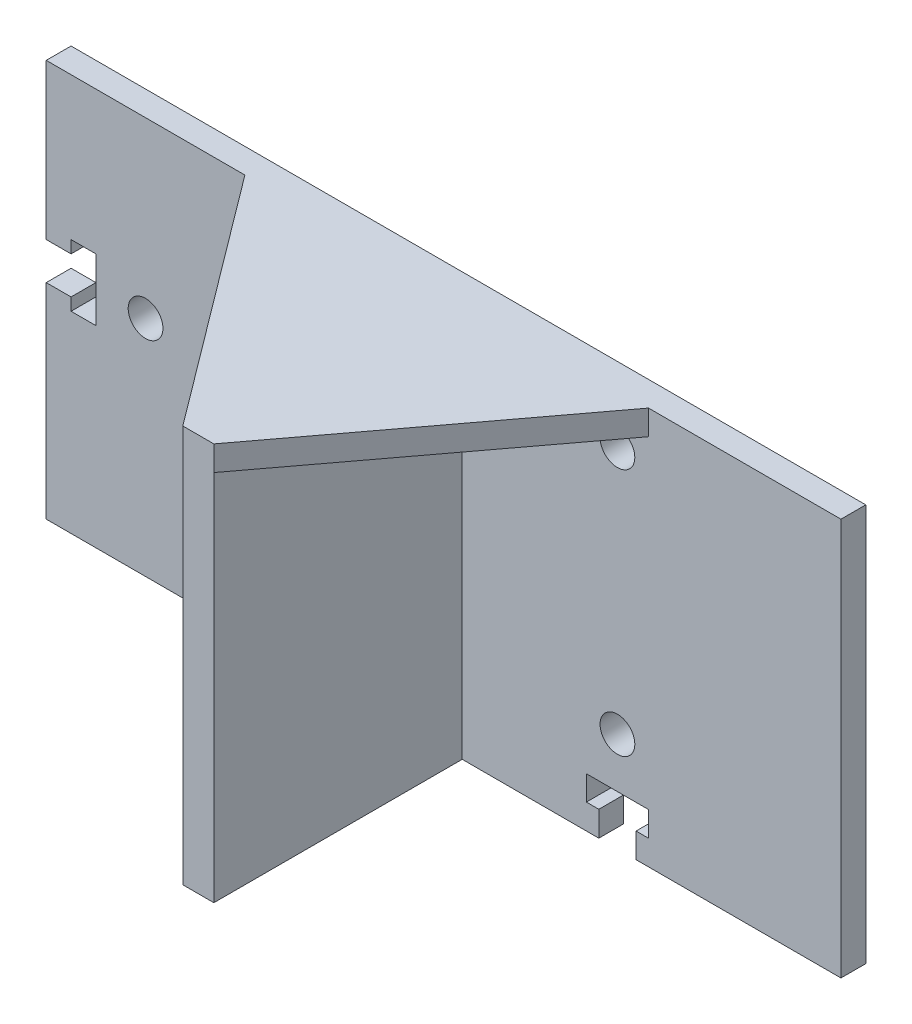
ISO-10303-21;
HEADER;
FILE_DESCRIPTION(('STEP AP214'),'2;1');
FILE_NAME('part.step','',(''),(''),'','','');
FILE_SCHEMA(('AUTOMOTIVE_DESIGN { 1 0 10303 214 1 1 1 1 }'));
ENDSEC;
DATA;
#1=APPLICATION_CONTEXT('core data for automotive mechanical design processes');
#2=APPLICATION_PROTOCOL_DEFINITION('international standard','automotive_design',2000,#1);
#3=PRODUCT_CONTEXT('',#1,'mechanical');
#4=PRODUCT('Part','Part','',(#3));
#5=PRODUCT_RELATED_PRODUCT_CATEGORY('part','',(#4));
#6=PRODUCT_DEFINITION_FORMATION('','',#4);
#7=PRODUCT_DEFINITION_CONTEXT('part definition',#1,'design');
#8=PRODUCT_DEFINITION('design','',#6,#7);
#9=PRODUCT_DEFINITION_SHAPE('','',#8);
#10=(LENGTH_UNIT() NAMED_UNIT(*) SI_UNIT(.MILLI.,.METRE.));
#11=(NAMED_UNIT(*) PLANE_ANGLE_UNIT() SI_UNIT($,.RADIAN.));
#12=(NAMED_UNIT(*) SI_UNIT($,.STERADIAN.) SOLID_ANGLE_UNIT());
#13=UNCERTAINTY_MEASURE_WITH_UNIT(LENGTH_MEASURE(1.E-05),#10,'distance_accuracy_value','');
#14=(GEOMETRIC_REPRESENTATION_CONTEXT(3) GLOBAL_UNCERTAINTY_ASSIGNED_CONTEXT((#13)) GLOBAL_UNIT_ASSIGNED_CONTEXT((#10,
#11,#12)) REPRESENTATION_CONTEXT('',''));
#15=CARTESIAN_POINT('',(0.,0.,0.));
#16=DIRECTION('',(0.,0.,1.));
#17=DIRECTION('',(1.,0.,0.));
#18=AXIS2_PLACEMENT_3D('',#15,#16,#17);
#19=CARTESIAN_POINT('',(0.,0.,2.));
#20=DIRECTION('',(0.,0.,1.));
#21=DIRECTION('',(1.,0.,0.));
#22=AXIS2_PLACEMENT_3D('',#19,#20,#21);
#23=PLANE('',#22);
#24=CARTESIAN_POINT('',(8.,18.,2.));
#25=DIRECTION('',(0.,0.,1.));
#26=DIRECTION('',(1.,0.,0.));
#27=AXIS2_PLACEMENT_3D('',#24,#25,#26);
#28=CIRCLE('',#27,1.4);
#29=CARTESIAN_POINT('',(9.4,18.,2.));
#30=VERTEX_POINT('',#29);
#31=EDGE_CURVE('E449',#30,#30,#28,.T.);
#32=ORIENTED_EDGE('',*,*,#31,.F.);
#33=EDGE_LOOP('',(#32));
#34=FACE_BOUND('',#33,.T.);
#35=CARTESIAN_POINT('',(28.,18.,2.));
#36=DIRECTION('',(0.,0.,1.));
#37=DIRECTION('',(1.,0.,0.));
#38=AXIS2_PLACEMENT_3D('',#35,#36,#37);
#39=CIRCLE('',#38,1.4);
#40=CARTESIAN_POINT('',(29.4,18.,2.));
#41=VERTEX_POINT('',#40);
#42=EDGE_CURVE('E459',#41,#41,#39,.T.);
#43=ORIENTED_EDGE('',*,*,#42,.F.);
#44=EDGE_LOOP('',(#43));
#45=FACE_BOUND('',#44,.T.);
#46=DIRECTION('',(0.,-1.,0.));
#47=VECTOR('',#46,1.);
#48=CARTESIAN_POINT('',(31.,30.,2.));
#49=LINE('',#48,#47);
#50=CARTESIAN_POINT('',(31.,30.,2.));
#51=VERTEX_POINT('',#50);
#52=CARTESIAN_POINT('',(31.,0.,2.));
#53=VERTEX_POINT('',#52);
#54=EDGE_CURVE('E231',#51,#53,#49,.T.);
#55=ORIENTED_EDGE('',*,*,#54,.F.);
#56=DIRECTION('',(1.,0.,0.));
#57=VECTOR('',#56,1.);
#58=CARTESIAN_POINT('',(31.,30.,2.));
#59=LINE('',#58,#57);
#60=CARTESIAN_POINT('',(16.,30.,2.));
#61=VERTEX_POINT('',#60);
#62=EDGE_CURVE('E264',#61,#51,#59,.T.);
#63=ORIENTED_EDGE('',*,*,#62,.F.);
#64=DIRECTION('',(0.,-1.,0.));
#65=VECTOR('',#64,1.);
#66=CARTESIAN_POINT('',(16.,32.,2.));
#67=LINE('',#66,#65);
#68=CARTESIAN_POINT('',(16.,32.,2.));
#69=VERTEX_POINT('',#68);
#70=EDGE_CURVE('E261',#69,#61,#67,.T.);
#71=ORIENTED_EDGE('',*,*,#70,.F.);
#72=DIRECTION('',(-1.,0.,0.));
#73=VECTOR('',#72,1.);
#74=CARTESIAN_POINT('',(0.,32.,2.));
#75=LINE('',#74,#73);
#76=CARTESIAN_POINT('',(0.,32.,2.));
#77=VERTEX_POINT('',#76);
#78=EDGE_CURVE('E259',#69,#77,#75,.T.);
#79=ORIENTED_EDGE('',*,*,#78,.T.);
#80=DIRECTION('',(0.,-1.,0.));
#81=VECTOR('',#80,1.);
#82=CARTESIAN_POINT('',(0.,32.,2.));
#83=LINE('',#82,#81);
#84=CARTESIAN_POINT('',(0.,19.5,2.));
#85=VERTEX_POINT('',#84);
#86=EDGE_CURVE('E258',#77,#85,#83,.T.);
#87=ORIENTED_EDGE('',*,*,#86,.T.);
#88=DIRECTION('',(1.,0.,0.));
#89=VECTOR('',#88,1.);
#90=CARTESIAN_POINT('',(0.,19.5,2.));
#91=LINE('',#90,#89);
#92=CARTESIAN_POINT('',(2.,19.5,2.));
#93=VERTEX_POINT('',#92);
#94=EDGE_CURVE('E305',#85,#93,#91,.T.);
#95=ORIENTED_EDGE('',*,*,#94,.T.);
#96=DIRECTION('',(0.,1.,0.));
#97=VECTOR('',#96,1.);
#98=CARTESIAN_POINT('',(2.,19.5,2.));
#99=LINE('',#98,#97);
#100=CARTESIAN_POINT('',(2.,20.5,2.));
#101=VERTEX_POINT('',#100);
#102=EDGE_CURVE('E307',#93,#101,#99,.T.);
#103=ORIENTED_EDGE('',*,*,#102,.T.);
#104=DIRECTION('',(1.,0.,0.));
#105=VECTOR('',#104,1.);
#106=CARTESIAN_POINT('',(2.,20.5,2.));
#107=LINE('',#106,#105);
#108=CARTESIAN_POINT('',(4.,20.5,2.));
#109=VERTEX_POINT('',#108);
#110=EDGE_CURVE('E309',#101,#109,#107,.T.);
#111=ORIENTED_EDGE('',*,*,#110,.T.);
#112=DIRECTION('',(0.,-1.,0.));
#113=VECTOR('',#112,1.);
#114=CARTESIAN_POINT('',(4.,20.5,2.));
#115=LINE('',#114,#113);
#116=CARTESIAN_POINT('',(4.,15.5,2.));
#117=VERTEX_POINT('',#116);
#118=EDGE_CURVE('E311',#109,#117,#115,.T.);
#119=ORIENTED_EDGE('',*,*,#118,.T.);
#120=DIRECTION('',(-1.,0.,0.));
#121=VECTOR('',#120,1.);
#122=CARTESIAN_POINT('',(2.,15.5,2.));
#123=LINE('',#122,#121);
#124=CARTESIAN_POINT('',(2.,15.5,2.));
#125=VERTEX_POINT('',#124);
#126=EDGE_CURVE('E313',#117,#125,#123,.T.);
#127=ORIENTED_EDGE('',*,*,#126,.T.);
#128=DIRECTION('',(0.,1.,0.));
#129=VECTOR('',#128,1.);
#130=CARTESIAN_POINT('',(2.,16.5,2.));
#131=LINE('',#130,#129);
#132=CARTESIAN_POINT('',(2.,16.5,2.));
#133=VERTEX_POINT('',#132);
#134=EDGE_CURVE('E315',#125,#133,#131,.T.);
#135=ORIENTED_EDGE('',*,*,#134,.T.);
#136=DIRECTION('',(-1.,0.,0.));
#137=VECTOR('',#136,1.);
#138=CARTESIAN_POINT('',(0.,16.5,2.));
#139=LINE('',#138,#137);
#140=CARTESIAN_POINT('',(0.,16.5,2.));
#141=VERTEX_POINT('',#140);
#142=EDGE_CURVE('E317',#133,#141,#139,.T.);
#143=ORIENTED_EDGE('',*,*,#142,.T.);
#144=DIRECTION('',(0.,-1.,0.));
#145=VECTOR('',#144,1.);
#146=CARTESIAN_POINT('',(0.,13.5,2.));
#147=LINE('',#146,#145);
#148=CARTESIAN_POINT('',(0.,0.,2.));
#149=VERTEX_POINT('',#148);
#150=EDGE_CURVE('E280',#141,#149,#147,.T.);
#151=ORIENTED_EDGE('',*,*,#150,.T.);
#152=DIRECTION('',(1.,0.,0.));
#153=VECTOR('',#152,1.);
#154=CARTESIAN_POINT('',(0.,0.,2.));
#155=LINE('',#154,#153);
#156=EDGE_CURVE('E285',#149,#53,#155,.T.);
#157=ORIENTED_EDGE('',*,*,#156,.T.);
#158=EDGE_LOOP('',(#55,#63,#71,#79,#87,#95,#103,#111,#119,#127,#135,#143,#151,#157));
#159=FACE_BOUND('',#158,.T.);
#160=ADVANCED_FACE('F32',(#34,#45,#159),#23,.T.);
#161=CARTESIAN_POINT('',(43.5,0.,2.));
#162=DIRECTION('',(0.,1.,0.));
#163=DIRECTION('',(0.,0.,1.));
#164=AXIS2_PLACEMENT_3D('',#161,#162,#163);
#165=PLANE('',#164);
#166=DIRECTION('',(1.,0.,0.));
#167=VECTOR('',#166,1.);
#168=CARTESIAN_POINT('',(43.5,0.,0.));
#169=LINE('',#168,#167);
#170=CARTESIAN_POINT('',(0.,0.,0.));
#171=VERTEX_POINT('',#170);
#172=CARTESIAN_POINT('',(44.5,0.,0.));
#173=VERTEX_POINT('',#172);
#174=EDGE_CURVE('E235',#171,#173,#169,.T.);
#175=ORIENTED_EDGE('',*,*,#174,.T.);
#176=DIRECTION('',(0.,0.,-1.));
#177=VECTOR('',#176,1.);
#178=CARTESIAN_POINT('',(44.5,0.,2.));
#179=LINE('',#178,#177);
#180=CARTESIAN_POINT('',(44.5,0.,2.));
#181=VERTEX_POINT('',#180);
#182=EDGE_CURVE('E413',#181,#173,#179,.T.);
#183=ORIENTED_EDGE('',*,*,#182,.F.);
#184=CARTESIAN_POINT('',(33.5,0.,2.));
#185=VERTEX_POINT('',#184);
#186=EDGE_CURVE('E283',#185,#181,#155,.T.);
#187=ORIENTED_EDGE('',*,*,#186,.F.);
#188=DIRECTION('',(0.,0.,-1.));
#189=VECTOR('',#188,1.);
#190=CARTESIAN_POINT('',(33.5,0.,22.));
#191=LINE('',#190,#189);
#192=CARTESIAN_POINT('',(33.5,0.,22.));
#193=VERTEX_POINT('',#192);
#194=EDGE_CURVE('E273',#193,#185,#191,.T.);
#195=ORIENTED_EDGE('',*,*,#194,.F.);
#196=DIRECTION('',(1.,0.,0.));
#197=VECTOR('',#196,1.);
#198=CARTESIAN_POINT('',(31.,0.,22.));
#199=LINE('',#198,#197);
#200=CARTESIAN_POINT('',(31.,0.,22.));
#201=VERTEX_POINT('',#200);
#202=EDGE_CURVE('E226',#201,#193,#199,.T.);
#203=ORIENTED_EDGE('',*,*,#202,.F.);
#204=DIRECTION('',(0.,0.,-1.));
#205=VECTOR('',#204,1.);
#206=CARTESIAN_POINT('',(31.,0.,22.));
#207=LINE('',#206,#205);
#208=EDGE_CURVE('E275',#201,#53,#207,.T.);
#209=ORIENTED_EDGE('',*,*,#208,.T.);
#210=ORIENTED_EDGE('',*,*,#156,.F.);
#211=DIRECTION('',(0.,0.,-1.));
#212=VECTOR('',#211,1.);
#213=CARTESIAN_POINT('',(0.,0.,2.));
#214=LINE('',#213,#212);
#215=EDGE_CURVE('E243',#149,#171,#214,.T.);
#216=ORIENTED_EDGE('',*,*,#215,.T.);
#217=EDGE_LOOP('',(#175,#183,#187,#195,#203,#209,#210,#216));
#218=FACE_BOUND('',#217,.T.);
#219=ADVANCED_FACE('F418',(#218),#165,.F.);
#220=CARTESIAN_POINT('',(44.5,0.,2.));
#221=DIRECTION('',(-1.,0.,0.));
#222=DIRECTION('',(0.,0.,1.));
#223=AXIS2_PLACEMENT_3D('',#220,#221,#222);
#224=PLANE('',#223);
#225=DIRECTION('',(0.,1.,0.));
#226=VECTOR('',#225,1.);
#227=CARTESIAN_POINT('',(44.5,0.,0.));
#228=LINE('',#227,#226);
#229=CARTESIAN_POINT('',(44.5,2.01818181824107,0.));
#230=VERTEX_POINT('',#229);
#231=EDGE_CURVE('E322',#173,#230,#228,.T.);
#232=ORIENTED_EDGE('',*,*,#231,.T.);
#233=DIRECTION('',(0.,0.,-1.));
#234=VECTOR('',#233,1.);
#235=CARTESIAN_POINT('',(44.5,2.01818181824107,2.));
#236=LINE('',#235,#234);
#237=CARTESIAN_POINT('',(44.5,2.01818181824107,2.));
#238=VERTEX_POINT('',#237);
#239=EDGE_CURVE('E410',#238,#230,#236,.T.);
#240=ORIENTED_EDGE('',*,*,#239,.F.);
#241=DIRECTION('',(0.,1.,0.));
#242=VECTOR('',#241,1.);
#243=CARTESIAN_POINT('',(44.5,0.,2.));
#244=LINE('',#243,#242);
#245=EDGE_CURVE('E287',#181,#238,#244,.T.);
#246=ORIENTED_EDGE('',*,*,#245,.F.);
#247=ORIENTED_EDGE('',*,*,#182,.T.);
#248=EDGE_LOOP('',(#232,#240,#246,#247));
#249=FACE_BOUND('',#248,.T.);
#250=ADVANCED_FACE('F433',(#249),#224,.F.);
#251=CARTESIAN_POINT('',(43.5,2.01818181824107,2.));
#252=DIRECTION('',(0.,-1.,0.));
#253=DIRECTION('',(0.,0.,-1.));
#254=AXIS2_PLACEMENT_3D('',#251,#252,#253);
#255=PLANE('',#254);
#256=DIRECTION('',(-1.,0.,0.));
#257=VECTOR('',#256,1.);
#258=CARTESIAN_POINT('',(43.5,2.01818181824107,0.));
#259=LINE('',#258,#257);
#260=CARTESIAN_POINT('',(43.5,2.01818181824107,0.));
#261=VERTEX_POINT('',#260);
#262=EDGE_CURVE('E324',#230,#261,#259,.T.);
#263=ORIENTED_EDGE('',*,*,#262,.T.);
#264=DIRECTION('',(0.,0.,-1.));
#265=VECTOR('',#264,1.);
#266=CARTESIAN_POINT('',(43.5,2.01818181824107,2.));
#267=LINE('',#266,#265);
#268=CARTESIAN_POINT('',(43.5,2.01818181824107,2.));
#269=VERTEX_POINT('',#268);
#270=EDGE_CURVE('E407',#269,#261,#267,.T.);
#271=ORIENTED_EDGE('',*,*,#270,.F.);
#272=DIRECTION('',(-1.,0.,0.));
#273=VECTOR('',#272,1.);
#274=CARTESIAN_POINT('',(43.5,2.01818181824107,2.));
#275=LINE('',#274,#273);
#276=EDGE_CURVE('E289',#238,#269,#275,.T.);
#277=ORIENTED_EDGE('',*,*,#276,.F.);
#278=ORIENTED_EDGE('',*,*,#239,.T.);
#279=EDGE_LOOP('',(#263,#271,#277,#278));
#280=FACE_BOUND('',#279,.T.);
#281=ADVANCED_FACE('F437',(#280),#255,.F.);
#282=CARTESIAN_POINT('',(43.5,4.,2.));
#283=DIRECTION('',(-1.,0.,0.));
#284=DIRECTION('',(0.,0.,1.));
#285=AXIS2_PLACEMENT_3D('',#282,#283,#284);
#286=PLANE('',#285);
#287=DIRECTION('',(0.,1.,0.));
#288=VECTOR('',#287,1.);
#289=CARTESIAN_POINT('',(43.5,4.,0.));
#290=LINE('',#289,#288);
#291=CARTESIAN_POINT('',(43.5,4.,0.));
#292=VERTEX_POINT('',#291);
#293=EDGE_CURVE('E326',#261,#292,#290,.T.);
#294=ORIENTED_EDGE('',*,*,#293,.T.);
#295=DIRECTION('',(0.,0.,-1.));
#296=VECTOR('',#295,1.);
#297=CARTESIAN_POINT('',(43.5,4.,2.));
#298=LINE('',#297,#296);
#299=CARTESIAN_POINT('',(43.5,4.,2.));
#300=VERTEX_POINT('',#299);
#301=EDGE_CURVE('E404',#300,#292,#298,.T.);
#302=ORIENTED_EDGE('',*,*,#301,.F.);
#303=DIRECTION('',(0.,1.,0.));
#304=VECTOR('',#303,1.);
#305=CARTESIAN_POINT('',(43.5,4.,2.));
#306=LINE('',#305,#304);
#307=EDGE_CURVE('E291',#269,#300,#306,.T.);
#308=ORIENTED_EDGE('',*,*,#307,.F.);
#309=ORIENTED_EDGE('',*,*,#270,.T.);
#310=EDGE_LOOP('',(#294,#302,#308,#309));
#311=FACE_BOUND('',#310,.T.);
#312=ADVANCED_FACE('F545',(#311),#286,.F.);
#313=CARTESIAN_POINT('',(43.5,4.,2.));
#314=DIRECTION('',(0.,1.,0.));
#315=DIRECTION('',(-1.,0.,0.));
#316=AXIS2_PLACEMENT_3D('',#313,#314,#315);
#317=PLANE('',#316);
#318=DIRECTION('',(1.,0.,0.));
#319=VECTOR('',#318,1.);
#320=CARTESIAN_POINT('',(43.5,4.,0.));
#321=LINE('',#320,#319);
#322=CARTESIAN_POINT('',(48.5,4.,0.));
#323=VERTEX_POINT('',#322);
#324=EDGE_CURVE('E328',#292,#323,#321,.T.);
#325=ORIENTED_EDGE('',*,*,#324,.T.);
#326=DIRECTION('',(0.,0.,-1.));
#327=VECTOR('',#326,1.);
#328=CARTESIAN_POINT('',(48.5,4.,2.));
#329=LINE('',#328,#327);
#330=CARTESIAN_POINT('',(48.5,4.,2.));
#331=VERTEX_POINT('',#330);
#332=EDGE_CURVE('E401',#331,#323,#329,.T.);
#333=ORIENTED_EDGE('',*,*,#332,.F.);
#334=DIRECTION('',(1.,0.,0.));
#335=VECTOR('',#334,1.);
#336=CARTESIAN_POINT('',(43.5,4.,2.));
#337=LINE('',#336,#335);
#338=EDGE_CURVE('E293',#300,#331,#337,.T.);
#339=ORIENTED_EDGE('',*,*,#338,.F.);
#340=ORIENTED_EDGE('',*,*,#301,.T.);
#341=EDGE_LOOP('',(#325,#333,#339,#340));
#342=FACE_BOUND('',#341,.T.);
#343=ADVANCED_FACE('F548',(#342),#317,.F.);
#344=CARTESIAN_POINT('',(48.5,4.,2.));
#345=DIRECTION('',(1.,0.,0.));
#346=DIRECTION('',(0.,0.,-1.));
#347=AXIS2_PLACEMENT_3D('',#344,#345,#346);
#348=PLANE('',#347);
#349=DIRECTION('',(0.,-1.,0.));
#350=VECTOR('',#349,1.);
#351=CARTESIAN_POINT('',(48.5,4.,0.));
#352=LINE('',#351,#350);
#353=CARTESIAN_POINT('',(48.5,2.,0.));
#354=VERTEX_POINT('',#353);
#355=EDGE_CURVE('E330',#323,#354,#352,.T.);
#356=ORIENTED_EDGE('',*,*,#355,.T.);
#357=DIRECTION('',(0.,0.,-1.));
#358=VECTOR('',#357,1.);
#359=CARTESIAN_POINT('',(48.5,2.,2.));
#360=LINE('',#359,#358);
#361=CARTESIAN_POINT('',(48.5,2.,2.));
#362=VERTEX_POINT('',#361);
#363=EDGE_CURVE('E398',#362,#354,#360,.T.);
#364=ORIENTED_EDGE('',*,*,#363,.F.);
#365=DIRECTION('',(0.,-1.,0.));
#366=VECTOR('',#365,1.);
#367=CARTESIAN_POINT('',(48.5,4.,2.));
#368=LINE('',#367,#366);
#369=EDGE_CURVE('E295',#331,#362,#368,.T.);
#370=ORIENTED_EDGE('',*,*,#369,.F.);
#371=ORIENTED_EDGE('',*,*,#332,.T.);
#372=EDGE_LOOP('',(#356,#364,#370,#371));
#373=FACE_BOUND('',#372,.T.);
#374=ADVANCED_FACE('F552',(#373),#348,.F.);
#375=CARTESIAN_POINT('',(48.5,2.,2.));
#376=DIRECTION('',(0.,-1.,0.));
#377=DIRECTION('',(0.,0.,-1.));
#378=AXIS2_PLACEMENT_3D('',#375,#376,#377);
#379=PLANE('',#378);
#380=DIRECTION('',(-1.,0.,0.));
#381=VECTOR('',#380,1.);
#382=CARTESIAN_POINT('',(48.5,2.,0.));
#383=LINE('',#382,#381);
#384=CARTESIAN_POINT('',(47.5,2.,0.));
#385=VERTEX_POINT('',#384);
#386=EDGE_CURVE('E332',#354,#385,#383,.T.);
#387=ORIENTED_EDGE('',*,*,#386,.T.);
#388=DIRECTION('',(0.,0.,-1.));
#389=VECTOR('',#388,1.);
#390=CARTESIAN_POINT('',(47.5,2.,2.));
#391=LINE('',#390,#389);
#392=CARTESIAN_POINT('',(47.5,2.,2.));
#393=VERTEX_POINT('',#392);
#394=EDGE_CURVE('E395',#393,#385,#391,.T.);
#395=ORIENTED_EDGE('',*,*,#394,.F.);
#396=DIRECTION('',(-1.,0.,0.));
#397=VECTOR('',#396,1.);
#398=CARTESIAN_POINT('',(48.5,2.,2.));
#399=LINE('',#398,#397);
#400=EDGE_CURVE('E297',#362,#393,#399,.T.);
#401=ORIENTED_EDGE('',*,*,#400,.F.);
#402=ORIENTED_EDGE('',*,*,#363,.T.);
#403=EDGE_LOOP('',(#387,#395,#401,#402));
#404=FACE_BOUND('',#403,.T.);
#405=ADVANCED_FACE('F556',(#404),#379,.F.);
#406=CARTESIAN_POINT('',(47.5,2.,2.));
#407=DIRECTION('',(1.,0.,0.));
#408=DIRECTION('',(0.,0.,-1.));
#409=AXIS2_PLACEMENT_3D('',#406,#407,#408);
#410=PLANE('',#409);
#411=DIRECTION('',(0.,-1.,0.));
#412=VECTOR('',#411,1.);
#413=CARTESIAN_POINT('',(47.5,2.,0.));
#414=LINE('',#413,#412);
#415=CARTESIAN_POINT('',(47.5,0.,0.));
#416=VERTEX_POINT('',#415);
#417=EDGE_CURVE('E334',#385,#416,#414,.T.);
#418=ORIENTED_EDGE('',*,*,#417,.T.);
#419=DIRECTION('',(0.,0.,-1.));
#420=VECTOR('',#419,1.);
#421=CARTESIAN_POINT('',(47.5,0.,2.));
#422=LINE('',#421,#420);
#423=CARTESIAN_POINT('',(47.5,0.,2.));
#424=VERTEX_POINT('',#423);
#425=EDGE_CURVE('E392',#424,#416,#422,.T.);
#426=ORIENTED_EDGE('',*,*,#425,.F.);
#427=DIRECTION('',(0.,-1.,0.));
#428=VECTOR('',#427,1.);
#429=CARTESIAN_POINT('',(47.5,2.,2.));
#430=LINE('',#429,#428);
#431=EDGE_CURVE('E299',#393,#424,#430,.T.);
#432=ORIENTED_EDGE('',*,*,#431,.F.);
#433=ORIENTED_EDGE('',*,*,#394,.T.);
#434=EDGE_LOOP('',(#418,#426,#432,#433));
#435=FACE_BOUND('',#434,.T.);
#436=ADVANCED_FACE('F560',(#435),#410,.F.);
#437=CARTESIAN_POINT('',(48.5,0.,2.));
#438=DIRECTION('',(0.,1.,0.));
#439=DIRECTION('',(0.,0.,1.));
#440=AXIS2_PLACEMENT_3D('',#437,#438,#439);
#441=PLANE('',#440);
#442=DIRECTION('',(1.,0.,0.));
#443=VECTOR('',#442,1.);
#444=CARTESIAN_POINT('',(48.5,0.,0.));
#445=LINE('',#444,#443);
#446=CARTESIAN_POINT('',(64.,0.,0.));
#447=VERTEX_POINT('',#446);
#448=EDGE_CURVE('E337',#416,#447,#445,.T.);
#449=ORIENTED_EDGE('',*,*,#448,.T.);
#450=DIRECTION('',(0.,0.,-1.));
#451=VECTOR('',#450,1.);
#452=CARTESIAN_POINT('',(64.,0.,2.));
#453=LINE('',#452,#451);
#454=CARTESIAN_POINT('',(64.,0.,2.));
#455=VERTEX_POINT('',#454);
#456=EDGE_CURVE('E389',#455,#447,#453,.T.);
#457=ORIENTED_EDGE('',*,*,#456,.F.);
#458=DIRECTION('',(1.,0.,0.));
#459=VECTOR('',#458,1.);
#460=CARTESIAN_POINT('',(48.5,0.,2.));
#461=LINE('',#460,#459);
#462=EDGE_CURVE('E301',#424,#455,#461,.T.);
#463=ORIENTED_EDGE('',*,*,#462,.F.);
#464=ORIENTED_EDGE('',*,*,#425,.T.);
#465=EDGE_LOOP('',(#449,#457,#463,#464));
#466=FACE_BOUND('',#465,.T.);
#467=ADVANCED_FACE('F564',(#466),#441,.F.);
#468=CARTESIAN_POINT('',(64.,0.,2.));
#469=DIRECTION('',(-1.,0.,0.));
#470=DIRECTION('',(0.,0.,1.));
#471=AXIS2_PLACEMENT_3D('',#468,#469,#470);
#472=PLANE('',#471);
#473=DIRECTION('',(0.,1.,0.));
#474=VECTOR('',#473,1.);
#475=CARTESIAN_POINT('',(64.,0.,0.));
#476=LINE('',#475,#474);
#477=CARTESIAN_POINT('',(64.,32.,0.));
#478=VERTEX_POINT('',#477);
#479=EDGE_CURVE('E339',#447,#478,#476,.T.);
#480=ORIENTED_EDGE('',*,*,#479,.T.);
#481=DIRECTION('',(0.,0.,-1.));
#482=VECTOR('',#481,1.);
#483=CARTESIAN_POINT('',(64.,32.,2.));
#484=LINE('',#483,#482);
#485=CARTESIAN_POINT('',(64.,32.,2.));
#486=VERTEX_POINT('',#485);
#487=EDGE_CURVE('E387',#486,#478,#484,.T.);
#488=ORIENTED_EDGE('',*,*,#487,.F.);
#489=DIRECTION('',(0.,1.,0.));
#490=VECTOR('',#489,1.);
#491=CARTESIAN_POINT('',(64.,0.,2.));
#492=LINE('',#491,#490);
#493=EDGE_CURVE('E256',#455,#486,#492,.T.);
#494=ORIENTED_EDGE('',*,*,#493,.F.);
#495=ORIENTED_EDGE('',*,*,#456,.T.);
#496=EDGE_LOOP('',(#480,#488,#494,#495));
#497=FACE_BOUND('',#496,.T.);
#498=ADVANCED_FACE('F568',(#497),#472,.F.);
#499=CARTESIAN_POINT('',(0.,32.,2.));
#500=DIRECTION('',(0.,-1.,0.));
#501=DIRECTION('',(0.,0.,-1.));
#502=AXIS2_PLACEMENT_3D('',#499,#500,#501);
#503=PLANE('',#502);
#504=DIRECTION('',(-1.,0.,0.));
#505=VECTOR('',#504,1.);
#506=CARTESIAN_POINT('',(29.4177173590802,32.,22.));
#507=LINE('',#506,#505);
#508=CARTESIAN_POINT('',(33.5,32.,22.));
#509=VERTEX_POINT('',#508);
#510=CARTESIAN_POINT('',(31.,32.,22.));
#511=VERTEX_POINT('',#510);
#512=EDGE_CURVE('E230',#509,#511,#507,.T.);
#513=ORIENTED_EDGE('',*,*,#512,.F.);
#514=DIRECTION('',(0.599999999999999,0.,-0.800000000000001));
#515=VECTOR('',#514,1.);
#516=CARTESIAN_POINT('',(33.4999999999999,32.,22.0000000000001));
#517=LINE('',#516,#515);
#518=CARTESIAN_POINT('',(48.5,32.,2.));
#519=VERTEX_POINT('',#518);
#520=EDGE_CURVE('E55',#509,#519,#517,.T.);
#521=ORIENTED_EDGE('',*,*,#520,.T.);
#522=EDGE_CURVE('E251',#486,#519,#75,.T.);
#523=ORIENTED_EDGE('',*,*,#522,.F.);
#524=ORIENTED_EDGE('',*,*,#487,.T.);
#525=DIRECTION('',(-1.,0.,0.));
#526=VECTOR('',#525,1.);
#527=CARTESIAN_POINT('',(0.,32.,0.));
#528=LINE('',#527,#526);
#529=CARTESIAN_POINT('',(0.,32.,0.));
#530=VERTEX_POINT('',#529);
#531=EDGE_CURVE('E341',#478,#530,#528,.T.);
#532=ORIENTED_EDGE('',*,*,#531,.T.);
#533=DIRECTION('',(0.,0.,-1.));
#534=VECTOR('',#533,1.);
#535=CARTESIAN_POINT('',(0.,32.,2.));
#536=LINE('',#535,#534);
#537=EDGE_CURVE('E384',#77,#530,#536,.T.);
#538=ORIENTED_EDGE('',*,*,#537,.F.);
#539=ORIENTED_EDGE('',*,*,#78,.F.);
#540=DIRECTION('',(0.599999999999999,0.,0.8));
#541=VECTOR('',#540,1.);
#542=CARTESIAN_POINT('',(31.,32.,22.));
#543=LINE('',#542,#541);
#544=EDGE_CURVE('E47',#69,#511,#543,.T.);
#545=ORIENTED_EDGE('',*,*,#544,.T.);
#546=EDGE_LOOP('',(#513,#521,#523,#524,#532,#538,#539,#545));
#547=FACE_BOUND('',#546,.T.);
#548=ADVANCED_FACE('F249',(#547),#503,.F.);
#549=CARTESIAN_POINT('',(0.,32.,2.));
#550=DIRECTION('',(1.,0.,0.));
#551=DIRECTION('',(0.,1.,0.));
#552=AXIS2_PLACEMENT_3D('',#549,#550,#551);
#553=PLANE('',#552);
#554=DIRECTION('',(0.,-1.,0.));
#555=VECTOR('',#554,1.);
#556=CARTESIAN_POINT('',(0.,32.,0.));
#557=LINE('',#556,#555);
#558=CARTESIAN_POINT('',(0.,19.5,0.));
#559=VERTEX_POINT('',#558);
#560=EDGE_CURVE('E343',#530,#559,#557,.T.);
#561=ORIENTED_EDGE('',*,*,#560,.T.);
#562=DIRECTION('',(0.,0.,-1.));
#563=VECTOR('',#562,1.);
#564=CARTESIAN_POINT('',(0.,19.5,2.));
#565=LINE('',#564,#563);
#566=EDGE_CURVE('E381',#85,#559,#565,.T.);
#567=ORIENTED_EDGE('',*,*,#566,.F.);
#568=ORIENTED_EDGE('',*,*,#86,.F.);
#569=ORIENTED_EDGE('',*,*,#537,.T.);
#570=EDGE_LOOP('',(#561,#567,#568,#569));
#571=FACE_BOUND('',#570,.T.);
#572=ADVANCED_FACE('F575',(#571),#553,.F.);
#573=CARTESIAN_POINT('',(0.,19.5,2.));
#574=DIRECTION('',(0.,1.,0.));
#575=DIRECTION('',(0.,0.,1.));
#576=AXIS2_PLACEMENT_3D('',#573,#574,#575);
#577=PLANE('',#576);
#578=DIRECTION('',(1.,0.,0.));
#579=VECTOR('',#578,1.);
#580=CARTESIAN_POINT('',(0.,19.5,0.));
#581=LINE('',#580,#579);
#582=CARTESIAN_POINT('',(2.,19.5,0.));
#583=VERTEX_POINT('',#582);
#584=EDGE_CURVE('E345',#559,#583,#581,.T.);
#585=ORIENTED_EDGE('',*,*,#584,.T.);
#586=DIRECTION('',(0.,0.,-1.));
#587=VECTOR('',#586,1.);
#588=CARTESIAN_POINT('',(2.,19.5,2.));
#589=LINE('',#588,#587);
#590=EDGE_CURVE('E378',#93,#583,#589,.T.);
#591=ORIENTED_EDGE('',*,*,#590,.F.);
#592=ORIENTED_EDGE('',*,*,#94,.F.);
#593=ORIENTED_EDGE('',*,*,#566,.T.);
#594=EDGE_LOOP('',(#585,#591,#592,#593));
#595=FACE_BOUND('',#594,.T.);
#596=ADVANCED_FACE('F578',(#595),#577,.F.);
#597=CARTESIAN_POINT('',(2.,19.5,2.));
#598=DIRECTION('',(-1.,0.,0.));
#599=DIRECTION('',(0.,0.,1.));
#600=AXIS2_PLACEMENT_3D('',#597,#598,#599);
#601=PLANE('',#600);
#602=DIRECTION('',(0.,1.,0.));
#603=VECTOR('',#602,1.);
#604=CARTESIAN_POINT('',(2.,19.5,0.));
#605=LINE('',#604,#603);
#606=CARTESIAN_POINT('',(2.,20.5,0.));
#607=VERTEX_POINT('',#606);
#608=EDGE_CURVE('E347',#583,#607,#605,.T.);
#609=ORIENTED_EDGE('',*,*,#608,.T.);
#610=DIRECTION('',(0.,0.,-1.));
#611=VECTOR('',#610,1.);
#612=CARTESIAN_POINT('',(2.,20.5,2.));
#613=LINE('',#612,#611);
#614=EDGE_CURVE('E375',#101,#607,#613,.T.);
#615=ORIENTED_EDGE('',*,*,#614,.F.);
#616=ORIENTED_EDGE('',*,*,#102,.F.);
#617=ORIENTED_EDGE('',*,*,#590,.T.);
#618=EDGE_LOOP('',(#609,#615,#616,#617));
#619=FACE_BOUND('',#618,.T.);
#620=ADVANCED_FACE('F582',(#619),#601,.F.);
#621=CARTESIAN_POINT('',(2.,20.5,2.));
#622=DIRECTION('',(0.,1.,0.));
#623=DIRECTION('',(0.,0.,1.));
#624=AXIS2_PLACEMENT_3D('',#621,#622,#623);
#625=PLANE('',#624);
#626=DIRECTION('',(1.,0.,0.));
#627=VECTOR('',#626,1.);
#628=CARTESIAN_POINT('',(2.,20.5,0.));
#629=LINE('',#628,#627);
#630=CARTESIAN_POINT('',(4.,20.5,0.));
#631=VERTEX_POINT('',#630);
#632=EDGE_CURVE('E349',#607,#631,#629,.T.);
#633=ORIENTED_EDGE('',*,*,#632,.T.);
#634=DIRECTION('',(0.,0.,-1.));
#635=VECTOR('',#634,1.);
#636=CARTESIAN_POINT('',(4.,20.5,2.));
#637=LINE('',#636,#635);
#638=EDGE_CURVE('E372',#109,#631,#637,.T.);
#639=ORIENTED_EDGE('',*,*,#638,.F.);
#640=ORIENTED_EDGE('',*,*,#110,.F.);
#641=ORIENTED_EDGE('',*,*,#614,.T.);
#642=EDGE_LOOP('',(#633,#639,#640,#641));
#643=FACE_BOUND('',#642,.T.);
#644=ADVANCED_FACE('F586',(#643),#625,.F.);
#645=CARTESIAN_POINT('',(4.,20.5,2.));
#646=DIRECTION('',(1.,0.,0.));
#647=DIRECTION('',(0.,1.,0.));
#648=AXIS2_PLACEMENT_3D('',#645,#646,#647);
#649=PLANE('',#648);
#650=DIRECTION('',(0.,-1.,0.));
#651=VECTOR('',#650,1.);
#652=CARTESIAN_POINT('',(4.,20.5,0.));
#653=LINE('',#652,#651);
#654=CARTESIAN_POINT('',(4.,15.5,0.));
#655=VERTEX_POINT('',#654);
#656=EDGE_CURVE('E351',#631,#655,#653,.T.);
#657=ORIENTED_EDGE('',*,*,#656,.T.);
#658=DIRECTION('',(0.,0.,-1.));
#659=VECTOR('',#658,1.);
#660=CARTESIAN_POINT('',(4.,15.5,2.));
#661=LINE('',#660,#659);
#662=EDGE_CURVE('E369',#117,#655,#661,.T.);
#663=ORIENTED_EDGE('',*,*,#662,.F.);
#664=ORIENTED_EDGE('',*,*,#118,.F.);
#665=ORIENTED_EDGE('',*,*,#638,.T.);
#666=EDGE_LOOP('',(#657,#663,#664,#665));
#667=FACE_BOUND('',#666,.T.);
#668=ADVANCED_FACE('F590',(#667),#649,.F.);
#669=CARTESIAN_POINT('',(2.,15.5,2.));
#670=DIRECTION('',(0.,-1.,0.));
#671=DIRECTION('',(0.,0.,-1.));
#672=AXIS2_PLACEMENT_3D('',#669,#670,#671);
#673=PLANE('',#672);
#674=DIRECTION('',(-1.,0.,0.));
#675=VECTOR('',#674,1.);
#676=CARTESIAN_POINT('',(2.,15.5,0.));
#677=LINE('',#676,#675);
#678=CARTESIAN_POINT('',(2.,15.5,0.));
#679=VERTEX_POINT('',#678);
#680=EDGE_CURVE('E353',#655,#679,#677,.T.);
#681=ORIENTED_EDGE('',*,*,#680,.T.);
#682=DIRECTION('',(0.,0.,-1.));
#683=VECTOR('',#682,1.);
#684=CARTESIAN_POINT('',(2.,15.5,2.));
#685=LINE('',#684,#683);
#686=EDGE_CURVE('E366',#125,#679,#685,.T.);
#687=ORIENTED_EDGE('',*,*,#686,.F.);
#688=ORIENTED_EDGE('',*,*,#126,.F.);
#689=ORIENTED_EDGE('',*,*,#662,.T.);
#690=EDGE_LOOP('',(#681,#687,#688,#689));
#691=FACE_BOUND('',#690,.T.);
#692=ADVANCED_FACE('F594',(#691),#673,.F.);
#693=CARTESIAN_POINT('',(2.,16.5,2.));
#694=DIRECTION('',(-1.,0.,0.));
#695=DIRECTION('',(0.,0.,1.));
#696=AXIS2_PLACEMENT_3D('',#693,#694,#695);
#697=PLANE('',#696);
#698=DIRECTION('',(0.,1.,0.));
#699=VECTOR('',#698,1.);
#700=CARTESIAN_POINT('',(2.,16.5,0.));
#701=LINE('',#700,#699);
#702=CARTESIAN_POINT('',(2.,16.5,0.));
#703=VERTEX_POINT('',#702);
#704=EDGE_CURVE('E355',#679,#703,#701,.T.);
#705=ORIENTED_EDGE('',*,*,#704,.T.);
#706=DIRECTION('',(0.,0.,-1.));
#707=VECTOR('',#706,1.);
#708=CARTESIAN_POINT('',(2.,16.5,2.));
#709=LINE('',#708,#707);
#710=EDGE_CURVE('E363',#133,#703,#709,.T.);
#711=ORIENTED_EDGE('',*,*,#710,.F.);
#712=ORIENTED_EDGE('',*,*,#134,.F.);
#713=ORIENTED_EDGE('',*,*,#686,.T.);
#714=EDGE_LOOP('',(#705,#711,#712,#713));
#715=FACE_BOUND('',#714,.T.);
#716=ADVANCED_FACE('F598',(#715),#697,.F.);
#717=CARTESIAN_POINT('',(0.,16.5,2.));
#718=DIRECTION('',(0.,-1.,0.));
#719=DIRECTION('',(0.,0.,-1.));
#720=AXIS2_PLACEMENT_3D('',#717,#718,#719);
#721=PLANE('',#720);
#722=DIRECTION('',(-1.,0.,0.));
#723=VECTOR('',#722,1.);
#724=CARTESIAN_POINT('',(0.,16.5,0.));
#725=LINE('',#724,#723);
#726=CARTESIAN_POINT('',(0.,16.5,0.));
#727=VERTEX_POINT('',#726);
#728=EDGE_CURVE('E357',#703,#727,#725,.T.);
#729=ORIENTED_EDGE('',*,*,#728,.T.);
#730=DIRECTION('',(0.,0.,-1.));
#731=VECTOR('',#730,1.);
#732=CARTESIAN_POINT('',(0.,16.5,2.));
#733=LINE('',#732,#731);
#734=EDGE_CURVE('E320',#141,#727,#733,.T.);
#735=ORIENTED_EDGE('',*,*,#734,.F.);
#736=ORIENTED_EDGE('',*,*,#142,.F.);
#737=ORIENTED_EDGE('',*,*,#710,.T.);
#738=EDGE_LOOP('',(#729,#735,#736,#737));
#739=FACE_BOUND('',#738,.T.);
#740=ADVANCED_FACE('F509',(#739),#721,.F.);
#741=CARTESIAN_POINT('',(0.,16.5,2.));
#742=DIRECTION('',(1.,0.,0.));
#743=DIRECTION('',(0.,1.,0.));
#744=AXIS2_PLACEMENT_3D('',#741,#742,#743);
#745=PLANE('',#744);
#746=DIRECTION('',(0.,-1.,0.));
#747=VECTOR('',#746,1.);
#748=CARTESIAN_POINT('',(0.,16.5,0.));
#749=LINE('',#748,#747);
#750=EDGE_CURVE('E284',#727,#171,#749,.T.);
#751=ORIENTED_EDGE('',*,*,#750,.T.);
#752=ORIENTED_EDGE('',*,*,#215,.F.);
#753=ORIENTED_EDGE('',*,*,#150,.F.);
#754=ORIENTED_EDGE('',*,*,#734,.T.);
#755=EDGE_LOOP('',(#751,#752,#753,#754));
#756=FACE_BOUND('',#755,.T.);
#757=ADVANCED_FACE('F421',(#756),#745,.F.);
#758=CARTESIAN_POINT('',(46.,28.,2.));
#759=DIRECTION('',(0.,0.,1.));
#760=DIRECTION('',(1.,0.,0.));
#761=AXIS2_PLACEMENT_3D('',#758,#759,#760);
#762=CIRCLE('',#761,1.4);
#763=CARTESIAN_POINT('',(47.4,28.,2.));
#764=VERTEX_POINT('',#763);
#765=EDGE_CURVE('E465',#764,#764,#762,.T.);
#766=ORIENTED_EDGE('',*,*,#765,.F.);
#767=EDGE_LOOP('',(#766));
#768=FACE_BOUND('',#767,.T.);
#769=CARTESIAN_POINT('',(46.,8.00000000000001,2.));
#770=DIRECTION('',(0.,0.,1.));
#771=DIRECTION('',(1.,0.,0.));
#772=AXIS2_PLACEMENT_3D('',#769,#770,#771);
#773=CIRCLE('',#772,1.4);
#774=CARTESIAN_POINT('',(47.4,8.00000000000001,2.));
#775=VERTEX_POINT('',#774);
#776=EDGE_CURVE('E471',#775,#775,#773,.T.);
#777=ORIENTED_EDGE('',*,*,#776,.F.);
#778=EDGE_LOOP('',(#777));
#779=FACE_BOUND('',#778,.T.);
#780=DIRECTION('',(0.,1.,0.));
#781=VECTOR('',#780,1.);
#782=CARTESIAN_POINT('',(33.5,30.,2.));
#783=LINE('',#782,#781);
#784=CARTESIAN_POINT('',(33.5,30.,2.));
#785=VERTEX_POINT('',#784);
#786=EDGE_CURVE('E234',#185,#785,#783,.T.);
#787=ORIENTED_EDGE('',*,*,#786,.F.);
#788=ORIENTED_EDGE('',*,*,#186,.T.);
#789=ORIENTED_EDGE('',*,*,#245,.T.);
#790=ORIENTED_EDGE('',*,*,#276,.T.);
#791=ORIENTED_EDGE('',*,*,#307,.T.);
#792=ORIENTED_EDGE('',*,*,#338,.T.);
#793=ORIENTED_EDGE('',*,*,#369,.T.);
#794=ORIENTED_EDGE('',*,*,#400,.T.);
#795=ORIENTED_EDGE('',*,*,#431,.T.);
#796=ORIENTED_EDGE('',*,*,#462,.T.);
#797=ORIENTED_EDGE('',*,*,#493,.T.);
#798=ORIENTED_EDGE('',*,*,#522,.T.);
#799=DIRECTION('',(0.,1.,0.));
#800=VECTOR('',#799,1.);
#801=CARTESIAN_POINT('',(48.5,32.,2.));
#802=LINE('',#801,#800);
#803=CARTESIAN_POINT('',(48.5,30.,2.));
#804=VERTEX_POINT('',#803);
#805=EDGE_CURVE('E254',#804,#519,#802,.T.);
#806=ORIENTED_EDGE('',*,*,#805,.F.);
#807=DIRECTION('',(1.,0.,0.));
#808=VECTOR('',#807,1.);
#809=CARTESIAN_POINT('',(33.5,30.,2.));
#810=LINE('',#809,#808);
#811=EDGE_CURVE('E219',#785,#804,#810,.T.);
#812=ORIENTED_EDGE('',*,*,#811,.F.);
#813=EDGE_LOOP('',(#787,#788,#789,#790,#791,#792,#793,#794,#795,#796,#797,#798,#806,#812));
#814=FACE_BOUND('',#813,.T.);
#815=ADVANCED_FACE('F253',(#768,#779,#814),#23,.T.);
#816=CARTESIAN_POINT('',(0.,0.,0.));
#817=DIRECTION('',(0.,0.,1.));
#818=DIRECTION('',(1.,0.,0.));
#819=AXIS2_PLACEMENT_3D('',#816,#817,#818);
#820=PLANE('',#819);
#821=CARTESIAN_POINT('',(8.,18.,0.));
#822=DIRECTION('',(0.,0.,1.));
#823=DIRECTION('',(1.,0.,0.));
#824=AXIS2_PLACEMENT_3D('',#821,#822,#823);
#825=CIRCLE('',#824,1.4);
#826=CARTESIAN_POINT('',(9.4,18.,0.));
#827=VERTEX_POINT('',#826);
#828=EDGE_CURVE('E447',#827,#827,#825,.T.);
#829=ORIENTED_EDGE('',*,*,#828,.T.);
#830=EDGE_LOOP('',(#829));
#831=FACE_BOUND('',#830,.T.);
#832=CARTESIAN_POINT('',(28.,18.,0.));
#833=DIRECTION('',(0.,0.,1.));
#834=DIRECTION('',(1.,0.,0.));
#835=AXIS2_PLACEMENT_3D('',#832,#833,#834);
#836=CIRCLE('',#835,1.4);
#837=CARTESIAN_POINT('',(29.4,18.,0.));
#838=VERTEX_POINT('',#837);
#839=EDGE_CURVE('E454',#838,#838,#836,.T.);
#840=ORIENTED_EDGE('',*,*,#839,.T.);
#841=EDGE_LOOP('',(#840));
#842=FACE_BOUND('',#841,.T.);
#843=CARTESIAN_POINT('',(46.,28.,0.));
#844=DIRECTION('',(0.,0.,1.));
#845=DIRECTION('',(1.,0.,0.));
#846=AXIS2_PLACEMENT_3D('',#843,#844,#845);
#847=CIRCLE('',#846,1.4);
#848=CARTESIAN_POINT('',(47.4,28.,0.));
#849=VERTEX_POINT('',#848);
#850=EDGE_CURVE('E462',#849,#849,#847,.T.);
#851=ORIENTED_EDGE('',*,*,#850,.T.);
#852=EDGE_LOOP('',(#851));
#853=FACE_BOUND('',#852,.T.);
#854=CARTESIAN_POINT('',(46.,8.00000000000001,0.));
#855=DIRECTION('',(0.,0.,1.));
#856=DIRECTION('',(1.,0.,0.));
#857=AXIS2_PLACEMENT_3D('',#854,#855,#856);
#858=CIRCLE('',#857,1.4);
#859=CARTESIAN_POINT('',(47.4,8.00000000000001,0.));
#860=VERTEX_POINT('',#859);
#861=EDGE_CURVE('E468',#860,#860,#858,.T.);
#862=ORIENTED_EDGE('',*,*,#861,.T.);
#863=EDGE_LOOP('',(#862));
#864=FACE_BOUND('',#863,.T.);
#865=ORIENTED_EDGE('',*,*,#174,.F.);
#866=ORIENTED_EDGE('',*,*,#750,.F.);
#867=ORIENTED_EDGE('',*,*,#728,.F.);
#868=ORIENTED_EDGE('',*,*,#704,.F.);
#869=ORIENTED_EDGE('',*,*,#680,.F.);
#870=ORIENTED_EDGE('',*,*,#656,.F.);
#871=ORIENTED_EDGE('',*,*,#632,.F.);
#872=ORIENTED_EDGE('',*,*,#608,.F.);
#873=ORIENTED_EDGE('',*,*,#584,.F.);
#874=ORIENTED_EDGE('',*,*,#560,.F.);
#875=ORIENTED_EDGE('',*,*,#531,.F.);
#876=ORIENTED_EDGE('',*,*,#479,.F.);
#877=ORIENTED_EDGE('',*,*,#448,.F.);
#878=ORIENTED_EDGE('',*,*,#417,.F.);
#879=ORIENTED_EDGE('',*,*,#386,.F.);
#880=ORIENTED_EDGE('',*,*,#355,.F.);
#881=ORIENTED_EDGE('',*,*,#324,.F.);
#882=ORIENTED_EDGE('',*,*,#293,.F.);
#883=ORIENTED_EDGE('',*,*,#262,.F.);
#884=ORIENTED_EDGE('',*,*,#231,.F.);
#885=EDGE_LOOP('',(#865,#866,#867,#868,#869,#870,#871,#872,#873,#874,#875,#876,#877,#878,#879,
#880,#881,#882,#883,#884));
#886=FACE_BOUND('',#885,.T.);
#887=ADVANCED_FACE('F426',(#831,#842,#853,#864,#886),#820,.F.);
#888=CARTESIAN_POINT('',(33.5,30.,22.));
#889=DIRECTION('',(-1.,0.,0.));
#890=DIRECTION('',(0.,-1.,0.));
#891=AXIS2_PLACEMENT_3D('',#888,#889,#890);
#892=PLANE('',#891);
#893=ORIENTED_EDGE('',*,*,#786,.T.);
#894=DIRECTION('',(0.,0.,-1.));
#895=VECTOR('',#894,1.);
#896=CARTESIAN_POINT('',(33.5,30.,22.));
#897=LINE('',#896,#895);
#898=CARTESIAN_POINT('',(33.5,30.,22.));
#899=VERTEX_POINT('',#898);
#900=EDGE_CURVE('E217',#899,#785,#897,.T.);
#901=ORIENTED_EDGE('',*,*,#900,.F.);
#902=DIRECTION('',(0.,1.,0.));
#903=VECTOR('',#902,1.);
#904=CARTESIAN_POINT('',(33.5,30.,22.));
#905=LINE('',#904,#903);
#906=EDGE_CURVE('E222',#193,#899,#905,.T.);
#907=ORIENTED_EDGE('',*,*,#906,.F.);
#908=ORIENTED_EDGE('',*,*,#194,.T.);
#909=EDGE_LOOP('',(#893,#901,#907,#908));
#910=FACE_BOUND('',#909,.T.);
#911=ADVANCED_FACE('F233',(#910),#892,.F.);
#912=CARTESIAN_POINT('',(33.5,30.,22.));
#913=DIRECTION('',(0.,1.,0.));
#914=DIRECTION('',(0.,0.,1.));
#915=AXIS2_PLACEMENT_3D('',#912,#913,#914);
#916=PLANE('',#915);
#917=ORIENTED_EDGE('',*,*,#811,.T.);
#918=DIRECTION('',(-0.599999999999999,0.,0.800000000000001));
#919=VECTOR('',#918,1.);
#920=CARTESIAN_POINT('',(33.4999999999999,30.,22.0000000000001));
#921=LINE('',#920,#919);
#922=EDGE_CURVE('E40',#804,#899,#921,.T.);
#923=ORIENTED_EDGE('',*,*,#922,.T.);
#924=ORIENTED_EDGE('',*,*,#900,.T.);
#925=EDGE_LOOP('',(#917,#923,#924));
#926=FACE_BOUND('',#925,.T.);
#927=ADVANCED_FACE('F215',(#926),#916,.F.);
#928=CARTESIAN_POINT('',(31.,30.,22.));
#929=DIRECTION('',(0.,1.,0.));
#930=DIRECTION('',(0.,0.,1.));
#931=AXIS2_PLACEMENT_3D('',#928,#929,#930);
#932=PLANE('',#931);
#933=DIRECTION('',(0.,0.,-1.));
#934=VECTOR('',#933,1.);
#935=CARTESIAN_POINT('',(31.,30.,22.));
#936=LINE('',#935,#934);
#937=CARTESIAN_POINT('',(31.,30.,22.));
#938=VERTEX_POINT('',#937);
#939=EDGE_CURVE('E236',#938,#51,#936,.T.);
#940=ORIENTED_EDGE('',*,*,#939,.F.);
#941=DIRECTION('',(-0.599999999999999,0.,-0.8));
#942=VECTOR('',#941,1.);
#943=CARTESIAN_POINT('',(31.,30.,22.));
#944=LINE('',#943,#942);
#945=EDGE_CURVE('E11',#938,#61,#944,.T.);
#946=ORIENTED_EDGE('',*,*,#945,.T.);
#947=ORIENTED_EDGE('',*,*,#62,.T.);
#948=EDGE_LOOP('',(#940,#946,#947));
#949=FACE_BOUND('',#948,.T.);
#950=ADVANCED_FACE('F478',(#949),#932,.F.);
#951=CARTESIAN_POINT('',(31.,30.,22.));
#952=DIRECTION('',(1.,0.,0.));
#953=DIRECTION('',(0.,1.,0.));
#954=AXIS2_PLACEMENT_3D('',#951,#952,#953);
#955=PLANE('',#954);
#956=ORIENTED_EDGE('',*,*,#54,.T.);
#957=ORIENTED_EDGE('',*,*,#208,.F.);
#958=DIRECTION('',(0.,-1.,0.));
#959=VECTOR('',#958,1.);
#960=CARTESIAN_POINT('',(31.,30.,22.));
#961=LINE('',#960,#959);
#962=EDGE_CURVE('E443',#938,#201,#961,.T.);
#963=ORIENTED_EDGE('',*,*,#962,.F.);
#964=ORIENTED_EDGE('',*,*,#939,.T.);
#965=EDGE_LOOP('',(#956,#957,#963,#964));
#966=FACE_BOUND('',#965,.T.);
#967=ADVANCED_FACE('F482',(#966),#955,.F.);
#968=CARTESIAN_POINT('',(0.,0.,22.));
#969=DIRECTION('',(0.,0.,1.));
#970=DIRECTION('',(1.,0.,0.));
#971=AXIS2_PLACEMENT_3D('',#968,#969,#970);
#972=PLANE('',#971);
#973=ORIENTED_EDGE('',*,*,#906,.T.);
#974=DIRECTION('',(0.,1.,0.));
#975=VECTOR('',#974,1.);
#976=CARTESIAN_POINT('',(33.5,32.0000000000001,22.));
#977=LINE('',#976,#975);
#978=EDGE_CURVE('E224',#899,#509,#977,.T.);
#979=ORIENTED_EDGE('',*,*,#978,.T.);
#980=ORIENTED_EDGE('',*,*,#512,.T.);
#981=DIRECTION('',(0.,-1.,0.));
#982=VECTOR('',#981,1.);
#983=CARTESIAN_POINT('',(31.,30.,22.));
#984=LINE('',#983,#982);
#985=EDGE_CURVE('E239',#511,#938,#984,.T.);
#986=ORIENTED_EDGE('',*,*,#985,.T.);
#987=ORIENTED_EDGE('',*,*,#962,.T.);
#988=ORIENTED_EDGE('',*,*,#202,.T.);
#989=EDGE_LOOP('',(#973,#979,#980,#986,#987,#988));
#990=FACE_BOUND('',#989,.T.);
#991=ADVANCED_FACE('F223',(#990),#972,.T.);
#992=CARTESIAN_POINT('',(46.,8.00000000000001,0.));
#993=DIRECTION('',(0.,0.,1.));
#994=DIRECTION('',(1.,0.,0.));
#995=AXIS2_PLACEMENT_3D('',#992,#993,#994);
#996=CYLINDRICAL_SURFACE('',#995,1.4);
#997=ORIENTED_EDGE('',*,*,#861,.F.);
#998=EDGE_LOOP('',(#997));
#999=FACE_BOUND('',#998,.T.);
#1000=ORIENTED_EDGE('',*,*,#776,.T.);
#1001=EDGE_LOOP('',(#1000));
#1002=FACE_BOUND('',#1001,.T.);
#1003=ADVANCED_FACE('F489',(#999,#1002),#996,.F.);
#1004=CARTESIAN_POINT('',(46.,28.,0.));
#1005=DIRECTION('',(0.,0.,1.));
#1006=DIRECTION('',(1.,0.,0.));
#1007=AXIS2_PLACEMENT_3D('',#1004,#1005,#1006);
#1008=CYLINDRICAL_SURFACE('',#1007,1.4);
#1009=ORIENTED_EDGE('',*,*,#850,.F.);
#1010=EDGE_LOOP('',(#1009));
#1011=FACE_BOUND('',#1010,.T.);
#1012=ORIENTED_EDGE('',*,*,#765,.T.);
#1013=EDGE_LOOP('',(#1012));
#1014=FACE_BOUND('',#1013,.T.);
#1015=ADVANCED_FACE('F516',(#1011,#1014),#1008,.F.);
#1016=CARTESIAN_POINT('',(28.,18.,0.));
#1017=DIRECTION('',(0.,0.,1.));
#1018=DIRECTION('',(1.,0.,0.));
#1019=AXIS2_PLACEMENT_3D('',#1016,#1017,#1018);
#1020=CYLINDRICAL_SURFACE('',#1019,1.4);
#1021=ORIENTED_EDGE('',*,*,#839,.F.);
#1022=EDGE_LOOP('',(#1021));
#1023=FACE_BOUND('',#1022,.T.);
#1024=ORIENTED_EDGE('',*,*,#42,.T.);
#1025=EDGE_LOOP('',(#1024));
#1026=FACE_BOUND('',#1025,.T.);
#1027=ADVANCED_FACE('F522',(#1023,#1026),#1020,.F.);
#1028=CARTESIAN_POINT('',(8.,18.,0.));
#1029=DIRECTION('',(0.,0.,1.));
#1030=DIRECTION('',(1.,0.,0.));
#1031=AXIS2_PLACEMENT_3D('',#1028,#1029,#1030);
#1032=CYLINDRICAL_SURFACE('',#1031,1.4);
#1033=ORIENTED_EDGE('',*,*,#828,.F.);
#1034=EDGE_LOOP('',(#1033));
#1035=FACE_BOUND('',#1034,.T.);
#1036=ORIENTED_EDGE('',*,*,#31,.T.);
#1037=EDGE_LOOP('',(#1036));
#1038=FACE_BOUND('',#1037,.T.);
#1039=ADVANCED_FACE('F529',(#1035,#1038),#1032,.F.);
#1040=CARTESIAN_POINT('',(33.4999999999998,-2.32452945780891E-13,22.));
#1041=DIRECTION('',(0.800000000000001,0.,0.599999999999999));
#1042=DIRECTION('',(0.,-1.,0.));
#1043=AXIS2_PLACEMENT_3D('',#1040,#1041,#1042);
#1044=PLANE('',#1043);
#1045=ORIENTED_EDGE('',*,*,#922,.F.);
#1046=ORIENTED_EDGE('',*,*,#805,.T.);
#1047=ORIENTED_EDGE('',*,*,#520,.F.);
#1048=ORIENTED_EDGE('',*,*,#978,.F.);
#1049=EDGE_LOOP('',(#1045,#1046,#1047,#1048));
#1050=FACE_BOUND('',#1049,.T.);
#1051=ADVANCED_FACE('F238',(#1050),#1044,.T.);
#1052=CARTESIAN_POINT('',(31.,0.,22.));
#1053=DIRECTION('',(-0.8,0.,0.599999999999999));
#1054=DIRECTION('',(0.,1.,0.));
#1055=AXIS2_PLACEMENT_3D('',#1052,#1053,#1054);
#1056=PLANE('',#1055);
#1057=ORIENTED_EDGE('',*,*,#544,.F.);
#1058=ORIENTED_EDGE('',*,*,#70,.T.);
#1059=ORIENTED_EDGE('',*,*,#945,.F.);
#1060=ORIENTED_EDGE('',*,*,#985,.F.);
#1061=EDGE_LOOP('',(#1057,#1058,#1059,#1060));
#1062=FACE_BOUND('',#1061,.T.);
#1063=ADVANCED_FACE('F34',(#1062),#1056,.T.);
#1064=CLOSED_SHELL('',(#160,#219,#250,#281,#312,#343,#374,#405,#436,#467,#498,#548,#572,#596,
#620,#644,#668,#692,#716,#740,#757,#815,#887,#911,#927,#950,#967,#991,#1003,#1015,#1027,#1039,
#1051,#1063));
#1065=MANIFOLD_SOLID_BREP('B2',#1064);
#1066=ADVANCED_BREP_SHAPE_REPRESENTATION('',(#18,#1065),#14);
#1067=SHAPE_DEFINITION_REPRESENTATION(#9,#1066);
ENDSEC;
END-ISO-10303-21;
